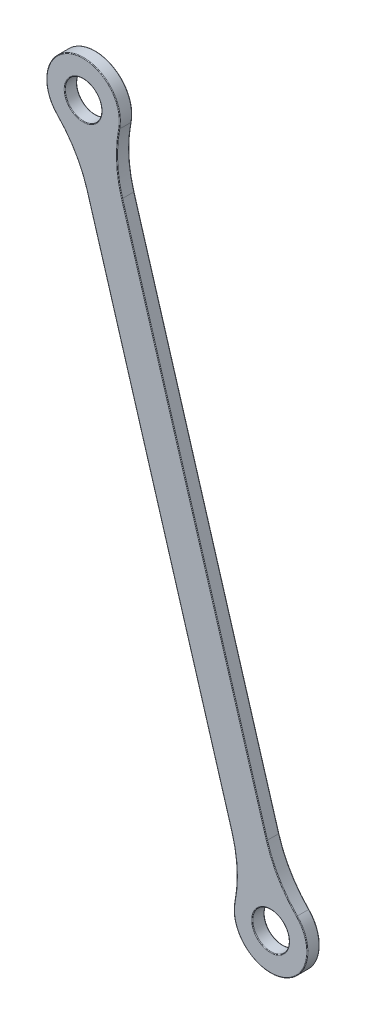
ISO-10303-21;
HEADER;
FILE_DESCRIPTION(('STEP AP214'),'2;1');
FILE_NAME('part.step','',(''),(''),'','','');
FILE_SCHEMA(('AUTOMOTIVE_DESIGN { 1 0 10303 214 1 1 1 1 }'));
ENDSEC;
DATA;
#1=APPLICATION_CONTEXT('core data for automotive mechanical design processes');
#2=APPLICATION_PROTOCOL_DEFINITION('international standard','automotive_design',2000,#1);
#3=PRODUCT_CONTEXT('',#1,'mechanical');
#4=PRODUCT('Part','Part','',(#3));
#5=PRODUCT_RELATED_PRODUCT_CATEGORY('part','',(#4));
#6=PRODUCT_DEFINITION_FORMATION('','',#4);
#7=PRODUCT_DEFINITION_CONTEXT('part definition',#1,'design');
#8=PRODUCT_DEFINITION('design','',#6,#7);
#9=PRODUCT_DEFINITION_SHAPE('','',#8);
#10=(LENGTH_UNIT() NAMED_UNIT(*) SI_UNIT(.MILLI.,.METRE.));
#11=(NAMED_UNIT(*) PLANE_ANGLE_UNIT() SI_UNIT($,.RADIAN.));
#12=(NAMED_UNIT(*) SI_UNIT($,.STERADIAN.) SOLID_ANGLE_UNIT());
#13=UNCERTAINTY_MEASURE_WITH_UNIT(LENGTH_MEASURE(1.E-05),#10,'distance_accuracy_value','');
#14=(GEOMETRIC_REPRESENTATION_CONTEXT(3) GLOBAL_UNCERTAINTY_ASSIGNED_CONTEXT((#13)) GLOBAL_UNIT_ASSIGNED_CONTEXT((#10,
#11,#12)) REPRESENTATION_CONTEXT('',''));
#15=CARTESIAN_POINT('',(0.,0.,0.));
#16=DIRECTION('',(0.,0.,1.));
#17=DIRECTION('',(1.,0.,0.));
#18=AXIS2_PLACEMENT_3D('',#15,#16,#17);
#19=CARTESIAN_POINT('',(-12.1462417472821,210.547331096124,-3.));
#20=DIRECTION('',(0.,0.,1.));
#21=DIRECTION('',(1.,0.,0.));
#22=AXIS2_PLACEMENT_3D('',#19,#20,#21);
#23=CYLINDRICAL_SURFACE('',#22,9.00000000000002);
#24=DIRECTION('',(0.,0.,1.));
#25=VECTOR('',#24,1.);
#26=CARTESIAN_POINT('',(-3.31507123833125,208.812272756518,-3.));
#27=LINE('',#26,#25);
#28=CARTESIAN_POINT('',(-3.31507123833125,208.812272756518,-0.15));
#29=VERTEX_POINT('',#28);
#30=CARTESIAN_POINT('',(-3.31507123833125,208.812272756518,-2.85));
#31=VERTEX_POINT('',#30);
#32=EDGE_CURVE('E312',#29,#31,#27,.F.);
#33=ORIENTED_EDGE('',*,*,#32,.T.);
#34=CARTESIAN_POINT('',(-12.1462417472821,210.547331096124,-2.85));
#35=DIRECTION('',(0.,0.,1.));
#36=DIRECTION('',(1.,0.,0.));
#37=AXIS2_PLACEMENT_3D('',#34,#35,#36);
#38=CIRCLE('',#37,9.00000000000002);
#39=CARTESIAN_POINT('',(-18.5681123038944,204.241811406668,-2.85));
#40=VERTEX_POINT('',#39);
#41=EDGE_CURVE('E227',#31,#40,#38,.T.);
#42=ORIENTED_EDGE('',*,*,#41,.T.);
#43=DIRECTION('',(0.,0.,1.));
#44=VECTOR('',#43,1.);
#45=CARTESIAN_POINT('',(-18.5681123038944,204.241811406668,-3.));
#46=LINE('',#45,#44);
#47=CARTESIAN_POINT('',(-18.5681123038944,204.241811406668,-0.15));
#48=VERTEX_POINT('',#47);
#49=EDGE_CURVE('E306',#40,#48,#46,.T.);
#50=ORIENTED_EDGE('',*,*,#49,.T.);
#51=CARTESIAN_POINT('',(-12.1462417472821,210.547331096124,-0.15));
#52=DIRECTION('',(0.,0.,1.));
#53=DIRECTION('',(1.,0.,0.));
#54=AXIS2_PLACEMENT_3D('',#51,#52,#53);
#55=CIRCLE('',#54,9.00000000000002);
#56=EDGE_CURVE('E225',#48,#29,#55,.F.);
#57=ORIENTED_EDGE('',*,*,#56,.T.);
#58=EDGE_LOOP('',(#33,#42,#50,#57));
#59=FACE_BOUND('',#58,.T.);
#60=ADVANCED_FACE('F41',(#59),#23,.T.);
#61=CARTESIAN_POINT('',(51.0562674674055,15.2986342936029,-3.));
#62=DIRECTION('',(-0.957920453392855,-0.287033804579924,0.));
#63=DIRECTION('',(0.287033804579924,-0.957920453392856,0.));
#64=AXIS2_PLACEMENT_3D('',#61,#62,#63);
#65=PLANE('',#64);
#66=DIRECTION('',(0.,0.,1.));
#67=VECTOR('',#66,1.);
#68=CARTESIAN_POINT('',(32.8696591290402,75.9929630701782,-3.));
#69=LINE('',#68,#67);
#70=CARTESIAN_POINT('',(32.8696591290402,75.9929630701782,-0.15));
#71=VERTEX_POINT('',#70);
#72=CARTESIAN_POINT('',(32.8696591290402,75.9929630701782,-2.85));
#73=VERTEX_POINT('',#72);
#74=EDGE_CURVE('E311',#71,#73,#69,.F.);
#75=ORIENTED_EDGE('',*,*,#74,.T.);
#76=DIRECTION('',(0.287033804579924,-0.957920453392856,0.));
#77=VECTOR('',#76,1.);
#78=CARTESIAN_POINT('',(51.0562674674055,15.2986342936029,-2.85));
#79=LINE('',#78,#77);
#80=CARTESIAN_POINT('',(-2.61544981028087,194.417730820432,-2.85));
#81=VERTEX_POINT('',#80);
#82=EDGE_CURVE('E219',#73,#81,#79,.F.);
#83=ORIENTED_EDGE('',*,*,#82,.T.);
#84=DIRECTION('',(0.,0.,1.));
#85=VECTOR('',#84,1.);
#86=CARTESIAN_POINT('',(-2.61544981028087,194.417730820432,-3.));
#87=LINE('',#86,#85);
#88=CARTESIAN_POINT('',(-2.61544981028087,194.417730820432,-0.15));
#89=VERTEX_POINT('',#88);
#90=EDGE_CURVE('E315',#81,#89,#87,.T.);
#91=ORIENTED_EDGE('',*,*,#90,.T.);
#92=DIRECTION('',(0.287033804579924,-0.957920453392856,0.));
#93=VECTOR('',#92,1.);
#94=CARTESIAN_POINT('',(32.8696591290402,75.9929630701783,-0.15));
#95=LINE('',#94,#93);
#96=EDGE_CURVE('E217',#89,#71,#95,.T.);
#97=ORIENTED_EDGE('',*,*,#96,.T.);
#98=EDGE_LOOP('',(#75,#83,#91,#97));
#99=FACE_BOUND('',#98,.T.);
#100=ADVANCED_FACE('F374',(#99),#65,.F.);
#101=CARTESIAN_POINT('',(33.7791669855057,57.2800585532673,-3.));
#102=DIRECTION('',(0.,0.,1.));
#103=DIRECTION('',(1.,0.,0.));
#104=AXIS2_PLACEMENT_3D('',#101,#102,#103);
#105=CYLINDRICAL_SURFACE('',#104,9.);
#106=DIRECTION('',(0.,0.,1.));
#107=VECTOR('',#106,1.);
#108=CARTESIAN_POINT('',(24.9479964765549,59.0151168928736,-3.));
#109=LINE('',#108,#107);
#110=CARTESIAN_POINT('',(24.9479964765549,59.0151168928736,-0.15));
#111=VERTEX_POINT('',#110);
#112=CARTESIAN_POINT('',(24.9479964765549,59.0151168928736,-2.85));
#113=VERTEX_POINT('',#112);
#114=EDGE_CURVE('E317',#111,#113,#109,.F.);
#115=ORIENTED_EDGE('',*,*,#114,.T.);
#116=CARTESIAN_POINT('',(33.7791669855057,57.2800585532673,-2.85));
#117=DIRECTION('',(0.,0.,1.));
#118=DIRECTION('',(1.,0.,0.));
#119=AXIS2_PLACEMENT_3D('',#116,#117,#118);
#120=CIRCLE('',#119,9.);
#121=CARTESIAN_POINT('',(40.2010375421181,63.5855782427231,-2.85));
#122=VERTEX_POINT('',#121);
#123=EDGE_CURVE('E210',#113,#122,#120,.T.);
#124=ORIENTED_EDGE('',*,*,#123,.T.);
#125=DIRECTION('',(0.,0.,1.));
#126=VECTOR('',#125,1.);
#127=CARTESIAN_POINT('',(40.2010375421181,63.5855782427231,-3.));
#128=LINE('',#127,#126);
#129=CARTESIAN_POINT('',(40.2010375421181,63.5855782427231,-0.15));
#130=VERTEX_POINT('',#129);
#131=EDGE_CURVE('E347',#122,#130,#128,.T.);
#132=ORIENTED_EDGE('',*,*,#131,.T.);
#133=CARTESIAN_POINT('',(33.7791669855057,57.2800585532673,-0.15));
#134=DIRECTION('',(0.,0.,1.));
#135=DIRECTION('',(1.,0.,0.));
#136=AXIS2_PLACEMENT_3D('',#133,#134,#135);
#137=CIRCLE('',#136,9.);
#138=EDGE_CURVE('E208',#130,#111,#137,.F.);
#139=ORIENTED_EDGE('',*,*,#138,.T.);
#140=EDGE_LOOP('',(#115,#124,#132,#139));
#141=FACE_BOUND('',#140,.T.);
#142=ADVANCED_FACE('F355',(#141),#105,.T.);
#143=CARTESIAN_POINT('',(42.4349833868698,12.7153300523836,-3.));
#144=DIRECTION('',(-0.957920453392855,-0.287033804579924,0.));
#145=DIRECTION('',(0.287033804579924,-0.957920453392856,0.));
#146=AXIS2_PLACEMENT_3D('',#143,#144,#145);
#147=PLANE('',#146);
#148=DIRECTION('',(0.,0.,-1.));
#149=VECTOR('',#148,1.);
#150=CARTESIAN_POINT('',(-11.2367338908166,191.834426579213,-3.));
#151=LINE('',#150,#149);
#152=CARTESIAN_POINT('',(-11.2367338908166,191.834426579213,-0.15));
#153=VERTEX_POINT('',#152);
#154=CARTESIAN_POINT('',(-11.2367338908166,191.834426579213,-2.85));
#155=VERTEX_POINT('',#154);
#156=EDGE_CURVE('E268',#153,#155,#151,.T.);
#157=ORIENTED_EDGE('',*,*,#156,.T.);
#158=DIRECTION('',(0.287033804579924,-0.957920453392856,0.));
#159=VECTOR('',#158,1.);
#160=CARTESIAN_POINT('',(24.2483750485045,73.4096588289591,-2.85));
#161=LINE('',#160,#159);
#162=CARTESIAN_POINT('',(24.2483750485045,73.409658828959,-2.85));
#163=VERTEX_POINT('',#162);
#164=EDGE_CURVE('E202',#155,#163,#161,.T.);
#165=ORIENTED_EDGE('',*,*,#164,.T.);
#166=DIRECTION('',(0.,0.,-1.));
#167=VECTOR('',#166,1.);
#168=CARTESIAN_POINT('',(24.2483750485045,73.409658828959,0.));
#169=LINE('',#168,#167);
#170=CARTESIAN_POINT('',(24.2483750485045,73.409658828959,-0.15));
#171=VERTEX_POINT('',#170);
#172=EDGE_CURVE('E345',#163,#171,#169,.F.);
#173=ORIENTED_EDGE('',*,*,#172,.T.);
#174=DIRECTION('',(0.287033804579924,-0.957920453392856,0.));
#175=VECTOR('',#174,1.);
#176=CARTESIAN_POINT('',(42.4349833868698,12.7153300523836,-0.15));
#177=LINE('',#176,#175);
#178=EDGE_CURVE('E200',#171,#153,#177,.F.);
#179=ORIENTED_EDGE('',*,*,#178,.T.);
#180=EDGE_LOOP('',(#157,#165,#173,#179));
#181=FACE_BOUND('',#180,.T.);
#182=ADVANCED_FACE('F344',(#181),#147,.T.);
#183=CARTESIAN_POINT('',(33.7791669855057,57.2800585532673,-3.));
#184=DIRECTION('',(0.,0.,1.));
#185=DIRECTION('',(1.,0.,0.));
#186=AXIS2_PLACEMENT_3D('',#183,#184,#185);
#187=CYLINDRICAL_SURFACE('',#186,4.49999999999998);
#188=CARTESIAN_POINT('',(33.7791669855057,57.2800585532673,-2.85));
#189=DIRECTION('',(0.,0.,1.));
#190=DIRECTION('',(1.,0.,0.));
#191=AXIS2_PLACEMENT_3D('',#188,#189,#190);
#192=CIRCLE('',#191,4.49999999999998);
#193=CARTESIAN_POINT('',(38.2791669855057,57.2800585532673,-2.85));
#194=VERTEX_POINT('',#193);
#195=EDGE_CURVE('E232',#194,#194,#192,.F.);
#196=ORIENTED_EDGE('',*,*,#195,.T.);
#197=EDGE_LOOP('',(#196));
#198=FACE_BOUND('',#197,.T.);
#199=CARTESIAN_POINT('',(33.7791669855057,57.2800585532673,-0.15));
#200=DIRECTION('',(0.,0.,1.));
#201=DIRECTION('',(1.,0.,0.));
#202=AXIS2_PLACEMENT_3D('',#199,#200,#201);
#203=CIRCLE('',#202,4.49999999999998);
#204=CARTESIAN_POINT('',(38.2791669855057,57.2800585532673,-0.15));
#205=VERTEX_POINT('',#204);
#206=EDGE_CURVE('E229',#205,#205,#203,.T.);
#207=ORIENTED_EDGE('',*,*,#206,.T.);
#208=EDGE_LOOP('',(#207));
#209=FACE_BOUND('',#208,.T.);
#210=ADVANCED_FACE('F410',(#198,#209),#187,.F.);
#211=CARTESIAN_POINT('',(-12.1462417472821,210.547331096124,-3.));
#212=DIRECTION('',(0.,0.,1.));
#213=DIRECTION('',(1.,0.,0.));
#214=AXIS2_PLACEMENT_3D('',#211,#212,#213);
#215=CYLINDRICAL_SURFACE('',#214,4.49999999999999);
#216=CARTESIAN_POINT('',(-12.1462417472821,210.547331096124,-2.85));
#217=DIRECTION('',(0.,0.,1.));
#218=DIRECTION('',(1.,0.,0.));
#219=AXIS2_PLACEMENT_3D('',#216,#217,#218);
#220=CIRCLE('',#219,4.49999999999999);
#221=CARTESIAN_POINT('',(-7.64624174728208,210.547331096124,-2.85));
#222=VERTEX_POINT('',#221);
#223=EDGE_CURVE('E194',#222,#222,#220,.F.);
#224=ORIENTED_EDGE('',*,*,#223,.T.);
#225=EDGE_LOOP('',(#224));
#226=FACE_BOUND('',#225,.T.);
#227=CARTESIAN_POINT('',(-12.1462417472821,210.547331096124,-0.15));
#228=DIRECTION('',(0.,0.,1.));
#229=DIRECTION('',(1.,0.,0.));
#230=AXIS2_PLACEMENT_3D('',#227,#228,#229);
#231=CIRCLE('',#230,4.49999999999999);
#232=CARTESIAN_POINT('',(-7.64624174728208,210.547331096124,-0.15));
#233=VERTEX_POINT('',#232);
#234=EDGE_CURVE('E186',#233,#233,#231,.T.);
#235=ORIENTED_EDGE('',*,*,#234,.T.);
#236=EDGE_LOOP('',(#235));
#237=FACE_BOUND('',#236,.T.);
#238=ADVANCED_FACE('F412',(#226,#237),#215,.F.);
#239=CARTESIAN_POINT('',(0.,0.,-3.));
#240=DIRECTION('',(0.,0.,1.));
#241=DIRECTION('',(1.,0.,0.));
#242=AXIS2_PLACEMENT_3D('',#239,#240,#241);
#243=PLANE('',#242);
#244=CARTESIAN_POINT('',(-12.1462417472821,210.547331096124,-3.));
#245=DIRECTION('',(0.,0.,1.));
#246=DIRECTION('',(1.,0.,0.));
#247=AXIS2_PLACEMENT_3D('',#244,#245,#246);
#248=CIRCLE('',#247,4.64999999999999);
#249=CARTESIAN_POINT('',(-7.49624174728208,210.547331096124,-3.));
#250=VERTEX_POINT('',#249);
#251=EDGE_CURVE('E183',#250,#250,#248,.T.);
#252=ORIENTED_EDGE('',*,*,#251,.T.);
#253=EDGE_LOOP('',(#252));
#254=FACE_BOUND('',#253,.T.);
#255=DIRECTION('',(0.287033804579924,-0.957920453392856,0.));
#256=VECTOR('',#255,1.);
#257=CARTESIAN_POINT('',(-11.0930458228077,191.8774816499,-3.));
#258=LINE('',#257,#256);
#259=CARTESIAN_POINT('',(24.3920631165135,73.452713899646,-3.));
#260=VERTEX_POINT('',#259);
#261=CARTESIAN_POINT('',(-11.0930458228076,191.8774816499,-3.));
#262=VERTEX_POINT('',#261);
#263=EDGE_CURVE('E181',#260,#262,#258,.F.);
#264=ORIENTED_EDGE('',*,*,#263,.T.);
#265=CARTESIAN_POINT('',(-39.9743474926022,183.223412441815,-3.));
#266=DIRECTION('',(0.,0.,1.));
#267=DIRECTION('',(1.,0.,0.));
#268=AXIS2_PLACEMENT_3D('',#265,#266,#267);
#269=CIRCLE('',#268,30.15);
#270=CARTESIAN_POINT('',(-18.4610811279509,204.346903401493,-3.));
#271=VERTEX_POINT('',#270);
#272=EDGE_CURVE('E161',#262,#271,#269,.T.);
#273=ORIENTED_EDGE('',*,*,#272,.T.);
#274=CARTESIAN_POINT('',(-12.1462417472821,210.547331096124,-3.));
#275=DIRECTION('',(0.,0.,1.));
#276=DIRECTION('',(1.,0.,0.));
#277=AXIS2_PLACEMENT_3D('',#274,#275,#276);
#278=CIRCLE('',#277,8.85000000000002);
#279=CARTESIAN_POINT('',(-3.46225741348043,208.841190395511,-3.));
#280=VERTEX_POINT('',#279);
#281=EDGE_CURVE('E169',#271,#280,#278,.F.);
#282=ORIENTED_EDGE('',*,*,#281,.T.);
#283=CARTESIAN_POINT('',(26.1221637915048,203.02874495783,-3.));
#284=DIRECTION('',(0.,0.,1.));
#285=DIRECTION('',(1.,0.,0.));
#286=AXIS2_PLACEMENT_3D('',#283,#284,#285);
#287=CIRCLE('',#286,30.15);
#288=CARTESIAN_POINT('',(-2.75913787828981,194.374675749745,-3.));
#289=VERTEX_POINT('',#288);
#290=EDGE_CURVE('E175',#280,#289,#287,.T.);
#291=ORIENTED_EDGE('',*,*,#290,.T.);
#292=DIRECTION('',(0.287033804579924,-0.957920453392856,0.));
#293=VECTOR('',#292,1.);
#294=CARTESIAN_POINT('',(50.9125793993966,15.2555792229159,-3.));
#295=LINE('',#294,#293);
#296=CARTESIAN_POINT('',(32.7259710610313,75.9499079994913,-3.));
#297=VERTEX_POINT('',#296);
#298=EDGE_CURVE('E326',#289,#297,#295,.T.);
#299=ORIENTED_EDGE('',*,*,#298,.T.);
#300=CARTESIAN_POINT('',(61.6072727308259,84.603977207576,-3.));
#301=DIRECTION('',(0.,0.,1.));
#302=DIRECTION('',(1.,0.,0.));
#303=AXIS2_PLACEMENT_3D('',#300,#301,#302);
#304=CIRCLE('',#303,30.15);
#305=CARTESIAN_POINT('',(40.0940063661745,63.4804862478988,-3.));
#306=VERTEX_POINT('',#305);
#307=EDGE_CURVE('E328',#297,#306,#304,.T.);
#308=ORIENTED_EDGE('',*,*,#307,.T.);
#309=CARTESIAN_POINT('',(33.7791669855057,57.2800585532673,-3.));
#310=DIRECTION('',(0.,0.,1.));
#311=DIRECTION('',(1.,0.,0.));
#312=AXIS2_PLACEMENT_3D('',#309,#310,#311);
#313=CIRCLE('',#312,8.85);
#314=CARTESIAN_POINT('',(25.0951826517041,58.9861992538801,-3.));
#315=VERTEX_POINT('',#314);
#316=EDGE_CURVE('E330',#306,#315,#313,.F.);
#317=ORIENTED_EDGE('',*,*,#316,.T.);
#318=CARTESIAN_POINT('',(-4.48923855328114,64.7986446915613,-3.));
#319=DIRECTION('',(0.,0.,1.));
#320=DIRECTION('',(1.,0.,0.));
#321=AXIS2_PLACEMENT_3D('',#318,#319,#320);
#322=CIRCLE('',#321,30.15);
#323=EDGE_CURVE('E188',#315,#260,#322,.T.);
#324=ORIENTED_EDGE('',*,*,#323,.T.);
#325=EDGE_LOOP('',(#264,#273,#282,#291,#299,#308,#317,#324));
#326=FACE_BOUND('',#325,.T.);
#327=CARTESIAN_POINT('',(33.7791669855057,57.2800585532673,-3.));
#328=DIRECTION('',(0.,0.,1.));
#329=DIRECTION('',(1.,0.,0.));
#330=AXIS2_PLACEMENT_3D('',#327,#328,#329);
#331=CIRCLE('',#330,4.64999999999998);
#332=CARTESIAN_POINT('',(38.4291669855057,57.2800585532673,-3.));
#333=VERTEX_POINT('',#332);
#334=EDGE_CURVE('E176',#333,#333,#331,.T.);
#335=ORIENTED_EDGE('',*,*,#334,.T.);
#336=EDGE_LOOP('',(#335));
#337=FACE_BOUND('',#336,.T.);
#338=ADVANCED_FACE('F178',(#254,#326,#337),#243,.F.);
#339=CARTESIAN_POINT('',(0.,0.,0.));
#340=DIRECTION('',(0.,0.,1.));
#341=DIRECTION('',(1.,0.,0.));
#342=AXIS2_PLACEMENT_3D('',#339,#340,#341);
#343=PLANE('',#342);
#344=CARTESIAN_POINT('',(-12.1462417472821,210.547331096124,0.));
#345=DIRECTION('',(0.,0.,1.));
#346=DIRECTION('',(1.,0.,0.));
#347=AXIS2_PLACEMENT_3D('',#344,#345,#346);
#348=CIRCLE('',#347,4.64999999999999);
#349=CARTESIAN_POINT('',(-7.49624174728208,210.547331096124,0.));
#350=VERTEX_POINT('',#349);
#351=EDGE_CURVE('E11',#350,#350,#348,.F.);
#352=ORIENTED_EDGE('',*,*,#351,.T.);
#353=EDGE_LOOP('',(#352));
#354=FACE_BOUND('',#353,.T.);
#355=CARTESIAN_POINT('',(33.7791669855057,57.2800585532673,0.));
#356=DIRECTION('',(0.,0.,1.));
#357=DIRECTION('',(1.,0.,0.));
#358=AXIS2_PLACEMENT_3D('',#355,#356,#357);
#359=CIRCLE('',#358,8.85);
#360=CARTESIAN_POINT('',(25.0951826517041,58.9861992538801,0.));
#361=VERTEX_POINT('',#360);
#362=CARTESIAN_POINT('',(40.0940063661745,63.4804862478988,0.));
#363=VERTEX_POINT('',#362);
#364=EDGE_CURVE('E58',#361,#363,#359,.T.);
#365=ORIENTED_EDGE('',*,*,#364,.T.);
#366=CARTESIAN_POINT('',(61.6072727308259,84.603977207576,0.));
#367=DIRECTION('',(0.,0.,1.));
#368=DIRECTION('',(1.,0.,0.));
#369=AXIS2_PLACEMENT_3D('',#366,#367,#368);
#370=CIRCLE('',#369,30.15);
#371=CARTESIAN_POINT('',(32.7259710610313,75.9499079994913,0.));
#372=VERTEX_POINT('',#371);
#373=EDGE_CURVE('E50',#363,#372,#370,.F.);
#374=ORIENTED_EDGE('',*,*,#373,.T.);
#375=DIRECTION('',(0.287033804579924,-0.957920453392856,0.));
#376=VECTOR('',#375,1.);
#377=CARTESIAN_POINT('',(-2.75913787828981,194.374675749745,0.));
#378=LINE('',#377,#376);
#379=CARTESIAN_POINT('',(-2.7591378782898,194.374675749745,0.));
#380=VERTEX_POINT('',#379);
#381=EDGE_CURVE('E238',#372,#380,#378,.F.);
#382=ORIENTED_EDGE('',*,*,#381,.T.);
#383=CARTESIAN_POINT('',(26.1221637915048,203.02874495783,0.));
#384=DIRECTION('',(0.,0.,1.));
#385=DIRECTION('',(1.,0.,0.));
#386=AXIS2_PLACEMENT_3D('',#383,#384,#385);
#387=CIRCLE('',#386,30.15);
#388=CARTESIAN_POINT('',(-3.46225741348043,208.841190395511,0.));
#389=VERTEX_POINT('',#388);
#390=EDGE_CURVE('E240',#380,#389,#387,.F.);
#391=ORIENTED_EDGE('',*,*,#390,.T.);
#392=CARTESIAN_POINT('',(-12.1462417472821,210.547331096124,0.));
#393=DIRECTION('',(0.,0.,1.));
#394=DIRECTION('',(1.,0.,0.));
#395=AXIS2_PLACEMENT_3D('',#392,#393,#394);
#396=CIRCLE('',#395,8.85000000000002);
#397=CARTESIAN_POINT('',(-18.4610811279509,204.346903401493,0.));
#398=VERTEX_POINT('',#397);
#399=EDGE_CURVE('E242',#389,#398,#396,.T.);
#400=ORIENTED_EDGE('',*,*,#399,.T.);
#401=CARTESIAN_POINT('',(-39.9743474926022,183.223412441815,0.));
#402=DIRECTION('',(0.,0.,1.));
#403=DIRECTION('',(1.,0.,0.));
#404=AXIS2_PLACEMENT_3D('',#401,#402,#403);
#405=CIRCLE('',#404,30.15);
#406=CARTESIAN_POINT('',(-11.0930458228076,191.8774816499,0.));
#407=VERTEX_POINT('',#406);
#408=EDGE_CURVE('E244',#398,#407,#405,.F.);
#409=ORIENTED_EDGE('',*,*,#408,.T.);
#410=DIRECTION('',(0.287033804579924,-0.957920453392856,0.));
#411=VECTOR('',#410,1.);
#412=CARTESIAN_POINT('',(42.5786714548788,12.7583851230706,0.));
#413=LINE('',#412,#411);
#414=CARTESIAN_POINT('',(24.3920631165135,73.452713899646,0.));
#415=VERTEX_POINT('',#414);
#416=EDGE_CURVE('E246',#407,#415,#413,.T.);
#417=ORIENTED_EDGE('',*,*,#416,.T.);
#418=CARTESIAN_POINT('',(-4.48923855328114,64.7986446915613,0.));
#419=DIRECTION('',(0.,0.,1.));
#420=DIRECTION('',(1.,0.,0.));
#421=AXIS2_PLACEMENT_3D('',#418,#419,#420);
#422=CIRCLE('',#421,30.15);
#423=EDGE_CURVE('E63',#415,#361,#422,.F.);
#424=ORIENTED_EDGE('',*,*,#423,.T.);
#425=EDGE_LOOP('',(#365,#374,#382,#391,#400,#409,#417,#424));
#426=FACE_BOUND('',#425,.T.);
#427=CARTESIAN_POINT('',(33.7791669855057,57.2800585532673,0.));
#428=DIRECTION('',(0.,0.,1.));
#429=DIRECTION('',(1.,0.,0.));
#430=AXIS2_PLACEMENT_3D('',#427,#428,#429);
#431=CIRCLE('',#430,4.64999999999998);
#432=CARTESIAN_POINT('',(38.4291669855057,57.2800585532673,0.));
#433=VERTEX_POINT('',#432);
#434=EDGE_CURVE('E235',#433,#433,#431,.F.);
#435=ORIENTED_EDGE('',*,*,#434,.T.);
#436=EDGE_LOOP('',(#435));
#437=FACE_BOUND('',#436,.T.);
#438=ADVANCED_FACE('F391',(#354,#426,#437),#343,.T.);
#439=CARTESIAN_POINT('',(-4.48923855328114,64.7986446915613,-3.));
#440=DIRECTION('',(0.,0.,1.));
#441=DIRECTION('',(1.,0.,0.));
#442=AXIS2_PLACEMENT_3D('',#439,#440,#441);
#443=CYLINDRICAL_SURFACE('',#442,30.);
#444=ORIENTED_EDGE('',*,*,#172,.F.);
#445=CARTESIAN_POINT('',(-4.48923855328114,64.7986446915613,-2.85));
#446=DIRECTION('',(0.,0.,1.));
#447=DIRECTION('',(1.,0.,0.));
#448=AXIS2_PLACEMENT_3D('',#445,#446,#447);
#449=CIRCLE('',#448,30.);
#450=EDGE_CURVE('E206',#163,#113,#449,.F.);
#451=ORIENTED_EDGE('',*,*,#450,.T.);
#452=ORIENTED_EDGE('',*,*,#114,.F.);
#453=CARTESIAN_POINT('',(-4.48923855328114,64.7986446915613,-0.15));
#454=DIRECTION('',(0.,0.,1.));
#455=DIRECTION('',(1.,0.,0.));
#456=AXIS2_PLACEMENT_3D('',#453,#454,#455);
#457=CIRCLE('',#456,30.);
#458=EDGE_CURVE('E204',#111,#171,#457,.T.);
#459=ORIENTED_EDGE('',*,*,#458,.T.);
#460=EDGE_LOOP('',(#444,#451,#452,#459));
#461=FACE_BOUND('',#460,.T.);
#462=ADVANCED_FACE('F389',(#461),#443,.F.);
#463=CARTESIAN_POINT('',(-39.9743474926022,183.223412441815,-3.));
#464=DIRECTION('',(0.,0.,1.));
#465=DIRECTION('',(1.,0.,0.));
#466=AXIS2_PLACEMENT_3D('',#463,#464,#465);
#467=CYLINDRICAL_SURFACE('',#466,30.);
#468=ORIENTED_EDGE('',*,*,#49,.F.);
#469=CARTESIAN_POINT('',(-39.9743474926022,183.223412441815,-2.85));
#470=DIRECTION('',(0.,0.,1.));
#471=DIRECTION('',(1.,0.,0.));
#472=AXIS2_PLACEMENT_3D('',#469,#470,#471);
#473=CIRCLE('',#472,30.);
#474=EDGE_CURVE('E163',#40,#155,#473,.F.);
#475=ORIENTED_EDGE('',*,*,#474,.T.);
#476=ORIENTED_EDGE('',*,*,#156,.F.);
#477=CARTESIAN_POINT('',(-39.9743474926022,183.223412441815,-0.15));
#478=DIRECTION('',(0.,0.,1.));
#479=DIRECTION('',(1.,0.,0.));
#480=AXIS2_PLACEMENT_3D('',#477,#478,#479);
#481=CIRCLE('',#480,30.);
#482=EDGE_CURVE('E197',#153,#48,#481,.T.);
#483=ORIENTED_EDGE('',*,*,#482,.T.);
#484=EDGE_LOOP('',(#468,#475,#476,#483));
#485=FACE_BOUND('',#484,.T.);
#486=ADVANCED_FACE('F305',(#485),#467,.F.);
#487=CARTESIAN_POINT('',(26.1221637915048,203.02874495783,-3.));
#488=DIRECTION('',(0.,0.,1.));
#489=DIRECTION('',(1.,0.,0.));
#490=AXIS2_PLACEMENT_3D('',#487,#488,#489);
#491=CYLINDRICAL_SURFACE('',#490,30.);
#492=ORIENTED_EDGE('',*,*,#90,.F.);
#493=CARTESIAN_POINT('',(26.1221637915048,203.02874495783,-2.85));
#494=DIRECTION('',(0.,0.,1.));
#495=DIRECTION('',(1.,0.,0.));
#496=AXIS2_PLACEMENT_3D('',#493,#494,#495);
#497=CIRCLE('',#496,30.);
#498=EDGE_CURVE('E223',#81,#31,#497,.F.);
#499=ORIENTED_EDGE('',*,*,#498,.T.);
#500=ORIENTED_EDGE('',*,*,#32,.F.);
#501=CARTESIAN_POINT('',(26.1221637915048,203.02874495783,-0.15));
#502=DIRECTION('',(0.,0.,1.));
#503=DIRECTION('',(1.,0.,0.));
#504=AXIS2_PLACEMENT_3D('',#501,#502,#503);
#505=CIRCLE('',#504,30.);
#506=EDGE_CURVE('E221',#29,#89,#505,.T.);
#507=ORIENTED_EDGE('',*,*,#506,.T.);
#508=EDGE_LOOP('',(#492,#499,#500,#507));
#509=FACE_BOUND('',#508,.T.);
#510=ADVANCED_FACE('F397',(#509),#491,.F.);
#511=CARTESIAN_POINT('',(61.6072727308259,84.603977207576,-3.));
#512=DIRECTION('',(0.,0.,1.));
#513=DIRECTION('',(1.,0.,0.));
#514=AXIS2_PLACEMENT_3D('',#511,#512,#513);
#515=CYLINDRICAL_SURFACE('',#514,30.);
#516=ORIENTED_EDGE('',*,*,#131,.F.);
#517=CARTESIAN_POINT('',(61.6072727308259,84.603977207576,-2.85));
#518=DIRECTION('',(0.,0.,1.));
#519=DIRECTION('',(1.,0.,0.));
#520=AXIS2_PLACEMENT_3D('',#517,#518,#519);
#521=CIRCLE('',#520,30.);
#522=EDGE_CURVE('E215',#122,#73,#521,.F.);
#523=ORIENTED_EDGE('',*,*,#522,.T.);
#524=ORIENTED_EDGE('',*,*,#74,.F.);
#525=CARTESIAN_POINT('',(61.6072727308259,84.603977207576,-0.15));
#526=DIRECTION('',(0.,0.,1.));
#527=DIRECTION('',(1.,0.,0.));
#528=AXIS2_PLACEMENT_3D('',#525,#526,#527);
#529=CIRCLE('',#528,30.);
#530=EDGE_CURVE('E212',#71,#130,#529,.T.);
#531=ORIENTED_EDGE('',*,*,#530,.T.);
#532=EDGE_LOOP('',(#516,#523,#524,#531));
#533=FACE_BOUND('',#532,.T.);
#534=ADVANCED_FACE('F371',(#533),#515,.F.);
#535=CARTESIAN_POINT('',(-12.1462417472821,210.547331096124,-2.85));
#536=DIRECTION('',(0.,0.,1.));
#537=DIRECTION('',(1.,0.,0.));
#538=AXIS2_PLACEMENT_3D('',#535,#536,#537);
#539=TOROIDAL_SURFACE('',#538,4.64999999999999,0.15);
#540=ORIENTED_EDGE('',*,*,#223,.F.);
#541=EDGE_LOOP('',(#540));
#542=FACE_BOUND('',#541,.T.);
#543=ORIENTED_EDGE('',*,*,#251,.F.);
#544=EDGE_LOOP('',(#543));
#545=FACE_BOUND('',#544,.T.);
#546=ADVANCED_FACE('F475',(#542,#545),#539,.T.);
#547=CARTESIAN_POINT('',(61.6072727308259,84.603977207576,-2.85));
#548=DIRECTION('',(0.,0.,1.));
#549=DIRECTION('',(1.,0.,0.));
#550=AXIS2_PLACEMENT_3D('',#547,#548,#549);
#551=TOROIDAL_SURFACE('',#550,30.15,0.15);
#552=CARTESIAN_POINT('',(32.7259710610313,75.9499079994913,-2.85));
#553=DIRECTION('',(-0.287033804579898,0.957920453392863,0.));
#554=DIRECTION('',(-0.957920453392863,-0.287033804579898,0.));
#555=AXIS2_PLACEMENT_3D('',#552,#553,#554);
#556=CIRCLE('',#555,0.15);
#557=EDGE_CURVE('E262',#73,#297,#556,.T.);
#558=ORIENTED_EDGE('',*,*,#557,.F.);
#559=ORIENTED_EDGE('',*,*,#522,.F.);
#560=CARTESIAN_POINT('',(40.0940063661745,63.4804862478988,-2.85));
#561=DIRECTION('',(0.700613298828439,-0.713541172956917,0.));
#562=DIRECTION('',(0.713541172956917,0.700613298828439,0.));
#563=AXIS2_PLACEMENT_3D('',#560,#561,#562);
#564=CIRCLE('',#563,0.15);
#565=EDGE_CURVE('E265',#306,#122,#564,.T.);
#566=ORIENTED_EDGE('',*,*,#565,.F.);
#567=ORIENTED_EDGE('',*,*,#307,.F.);
#568=EDGE_LOOP('',(#558,#559,#566,#567));
#569=FACE_BOUND('',#568,.T.);
#570=ADVANCED_FACE('F367',(#569),#551,.T.);
#571=CARTESIAN_POINT('',(33.7791669855057,57.2800585532673,-2.85));
#572=DIRECTION('',(0.,0.,1.));
#573=DIRECTION('',(1.,0.,0.));
#574=AXIS2_PLACEMENT_3D('',#571,#572,#573);
#575=TOROIDAL_SURFACE('',#574,8.85,0.15);
#576=ORIENTED_EDGE('',*,*,#565,.T.);
#577=ORIENTED_EDGE('',*,*,#123,.F.);
#578=CARTESIAN_POINT('',(25.0951826517041,58.9861992538801,-2.85));
#579=DIRECTION('',(0.192784259956252,0.981241167661203,0.));
#580=DIRECTION('',(-0.981241167661203,0.192784259956252,0.));
#581=AXIS2_PLACEMENT_3D('',#578,#579,#580);
#582=CIRCLE('',#581,0.15);
#583=EDGE_CURVE('E259',#315,#113,#582,.T.);
#584=ORIENTED_EDGE('',*,*,#583,.F.);
#585=ORIENTED_EDGE('',*,*,#316,.F.);
#586=EDGE_LOOP('',(#576,#577,#584,#585));
#587=FACE_BOUND('',#586,.T.);
#588=ADVANCED_FACE('F361',(#587),#575,.T.);
#589=CARTESIAN_POINT('',(50.9125793993966,15.2555792229159,-2.85));
#590=DIRECTION('',(0.287033804579924,-0.957920453392856,0.));
#591=DIRECTION('',(0.957920453392856,0.287033804579924,0.));
#592=AXIS2_PLACEMENT_3D('',#589,#590,#591);
#593=CYLINDRICAL_SURFACE('',#592,0.15);
#594=ORIENTED_EDGE('',*,*,#557,.T.);
#595=ORIENTED_EDGE('',*,*,#298,.F.);
#596=CARTESIAN_POINT('',(-2.7591378782898,194.374675749745,-2.85));
#597=DIRECTION('',(-0.287033804579982,0.957920453392838,0.));
#598=DIRECTION('',(-0.957920453392838,-0.287033804579982,0.));
#599=AXIS2_PLACEMENT_3D('',#596,#597,#598);
#600=CIRCLE('',#599,0.15);
#601=EDGE_CURVE('E256',#81,#289,#600,.T.);
#602=ORIENTED_EDGE('',*,*,#601,.F.);
#603=ORIENTED_EDGE('',*,*,#82,.F.);
#604=EDGE_LOOP('',(#594,#595,#602,#603));
#605=FACE_BOUND('',#604,.T.);
#606=ADVANCED_FACE('F478',(#605),#593,.T.);
#607=CARTESIAN_POINT('',(-4.48923855328114,64.7986446915613,-2.85));
#608=DIRECTION('',(0.,0.,1.));
#609=DIRECTION('',(1.,0.,0.));
#610=AXIS2_PLACEMENT_3D('',#607,#608,#609);
#611=TOROIDAL_SURFACE('',#610,30.15,0.15);
#612=ORIENTED_EDGE('',*,*,#583,.T.);
#613=ORIENTED_EDGE('',*,*,#450,.F.);
#614=CARTESIAN_POINT('',(24.3920631165135,73.452713899646,-2.85));
#615=DIRECTION('',(-0.287033804579892,0.957920453392865,0.));
#616=DIRECTION('',(-0.957920453392865,-0.287033804579892,0.));
#617=AXIS2_PLACEMENT_3D('',#614,#615,#616);
#618=CIRCLE('',#617,0.15);
#619=EDGE_CURVE('E253',#260,#163,#618,.T.);
#620=ORIENTED_EDGE('',*,*,#619,.F.);
#621=ORIENTED_EDGE('',*,*,#323,.F.);
#622=EDGE_LOOP('',(#612,#613,#620,#621));
#623=FACE_BOUND('',#622,.T.);
#624=ADVANCED_FACE('F337',(#623),#611,.T.);
#625=CARTESIAN_POINT('',(26.1221637915048,203.02874495783,-2.85));
#626=DIRECTION('',(0.,0.,1.));
#627=DIRECTION('',(1.,0.,0.));
#628=AXIS2_PLACEMENT_3D('',#625,#626,#627);
#629=TOROIDAL_SURFACE('',#628,30.15,0.15);
#630=ORIENTED_EDGE('',*,*,#601,.T.);
#631=ORIENTED_EDGE('',*,*,#290,.F.);
#632=CARTESIAN_POINT('',(-3.46225741348043,208.841190395511,-2.85));
#633=DIRECTION('',(0.192784259956208,0.981241167661211,0.));
#634=DIRECTION('',(-0.981241167661211,0.192784259956208,0.));
#635=AXIS2_PLACEMENT_3D('',#632,#633,#634);
#636=CIRCLE('',#635,0.15);
#637=EDGE_CURVE('E172',#31,#280,#636,.T.);
#638=ORIENTED_EDGE('',*,*,#637,.F.);
#639=ORIENTED_EDGE('',*,*,#498,.F.);
#640=EDGE_LOOP('',(#630,#631,#638,#639));
#641=FACE_BOUND('',#640,.T.);
#642=ADVANCED_FACE('F484',(#641),#629,.T.);
#643=CARTESIAN_POINT('',(42.5786714548788,12.7583851230706,-2.85));
#644=DIRECTION('',(-0.287033804579924,0.957920453392856,0.));
#645=DIRECTION('',(-0.957920453392856,-0.287033804579924,0.));
#646=AXIS2_PLACEMENT_3D('',#643,#644,#645);
#647=CYLINDRICAL_SURFACE('',#646,0.15);
#648=ORIENTED_EDGE('',*,*,#619,.T.);
#649=ORIENTED_EDGE('',*,*,#164,.F.);
#650=CARTESIAN_POINT('',(-11.0930458228076,191.8774816499,-2.85));
#651=DIRECTION('',(-0.287033804579977,0.95792045339284,0.));
#652=DIRECTION('',(-0.95792045339284,-0.287033804579977,0.));
#653=AXIS2_PLACEMENT_3D('',#650,#651,#652);
#654=CIRCLE('',#653,0.15);
#655=EDGE_CURVE('E166',#262,#155,#654,.T.);
#656=ORIENTED_EDGE('',*,*,#655,.F.);
#657=ORIENTED_EDGE('',*,*,#263,.F.);
#658=EDGE_LOOP('',(#648,#649,#656,#657));
#659=FACE_BOUND('',#658,.T.);
#660=ADVANCED_FACE('F340',(#659),#647,.T.);
#661=CARTESIAN_POINT('',(-12.1462417472821,210.547331096124,-2.85));
#662=DIRECTION('',(0.,0.,1.));
#663=DIRECTION('',(1.,0.,0.));
#664=AXIS2_PLACEMENT_3D('',#661,#662,#663);
#665=TOROIDAL_SURFACE('',#664,8.85000000000002,0.15);
#666=ORIENTED_EDGE('',*,*,#637,.T.);
#667=ORIENTED_EDGE('',*,*,#281,.F.);
#668=CARTESIAN_POINT('',(-18.4610811279509,204.346903401493,-2.85));
#669=DIRECTION('',(0.700613298828392,-0.713541172956963,0.));
#670=DIRECTION('',(0.713541172956963,0.700613298828392,0.));
#671=AXIS2_PLACEMENT_3D('',#668,#669,#670);
#672=CIRCLE('',#671,0.15);
#673=EDGE_CURVE('E157',#40,#271,#672,.T.);
#674=ORIENTED_EDGE('',*,*,#673,.F.);
#675=ORIENTED_EDGE('',*,*,#41,.F.);
#676=EDGE_LOOP('',(#666,#667,#674,#675));
#677=FACE_BOUND('',#676,.T.);
#678=ADVANCED_FACE('F170',(#677),#665,.T.);
#679=CARTESIAN_POINT('',(-39.9743474926022,183.223412441815,-2.85));
#680=DIRECTION('',(0.,0.,1.));
#681=DIRECTION('',(1.,0.,0.));
#682=AXIS2_PLACEMENT_3D('',#679,#680,#681);
#683=TOROIDAL_SURFACE('',#682,30.15,0.15);
#684=ORIENTED_EDGE('',*,*,#655,.T.);
#685=ORIENTED_EDGE('',*,*,#474,.F.);
#686=ORIENTED_EDGE('',*,*,#673,.T.);
#687=ORIENTED_EDGE('',*,*,#272,.F.);
#688=EDGE_LOOP('',(#684,#685,#686,#687));
#689=FACE_BOUND('',#688,.T.);
#690=ADVANCED_FACE('F159',(#689),#683,.T.);
#691=CARTESIAN_POINT('',(33.7791669855057,57.2800585532673,-2.85));
#692=DIRECTION('',(0.,0.,1.));
#693=DIRECTION('',(1.,0.,0.));
#694=AXIS2_PLACEMENT_3D('',#691,#692,#693);
#695=TOROIDAL_SURFACE('',#694,4.64999999999998,0.15);
#696=ORIENTED_EDGE('',*,*,#334,.F.);
#697=EDGE_LOOP('',(#696));
#698=FACE_BOUND('',#697,.T.);
#699=ORIENTED_EDGE('',*,*,#195,.F.);
#700=EDGE_LOOP('',(#699));
#701=FACE_BOUND('',#700,.T.);
#702=ADVANCED_FACE('F456',(#698,#701),#695,.T.);
#703=CARTESIAN_POINT('',(-12.1462417472821,210.547331096124,-0.15));
#704=DIRECTION('',(0.,0.,1.));
#705=DIRECTION('',(1.,0.,0.));
#706=AXIS2_PLACEMENT_3D('',#703,#704,#705);
#707=TOROIDAL_SURFACE('',#706,4.64999999999999,0.15);
#708=ORIENTED_EDGE('',*,*,#351,.F.);
#709=EDGE_LOOP('',(#708));
#710=FACE_BOUND('',#709,.T.);
#711=ORIENTED_EDGE('',*,*,#234,.F.);
#712=EDGE_LOOP('',(#711));
#713=FACE_BOUND('',#712,.T.);
#714=ADVANCED_FACE('F437',(#710,#713),#707,.T.);
#715=CARTESIAN_POINT('',(-39.9743474926022,183.223412441815,-0.15));
#716=DIRECTION('',(0.,0.,1.));
#717=DIRECTION('',(1.,0.,0.));
#718=AXIS2_PLACEMENT_3D('',#715,#716,#717);
#719=TOROIDAL_SURFACE('',#718,30.15,0.15);
#720=CARTESIAN_POINT('',(-18.4610811279509,204.346903401493,-0.15));
#721=DIRECTION('',(-0.700613298828392,0.713541172956963,0.));
#722=DIRECTION('',(-0.713541172956963,-0.700613298828392,0.));
#723=AXIS2_PLACEMENT_3D('',#720,#721,#722);
#724=CIRCLE('',#723,0.15);
#725=EDGE_CURVE('E284',#48,#398,#724,.T.);
#726=ORIENTED_EDGE('',*,*,#725,.F.);
#727=ORIENTED_EDGE('',*,*,#482,.F.);
#728=CARTESIAN_POINT('',(-11.0930458228076,191.8774816499,-0.15));
#729=DIRECTION('',(0.287033804579989,-0.957920453392836,0.));
#730=DIRECTION('',(0.957920453392836,0.28703380457999,0.));
#731=AXIS2_PLACEMENT_3D('',#728,#729,#730);
#732=CIRCLE('',#731,0.15);
#733=EDGE_CURVE('E45',#407,#153,#732,.T.);
#734=ORIENTED_EDGE('',*,*,#733,.F.);
#735=ORIENTED_EDGE('',*,*,#408,.F.);
#736=EDGE_LOOP('',(#726,#727,#734,#735));
#737=FACE_BOUND('',#736,.T.);
#738=ADVANCED_FACE('F300',(#737),#719,.T.);
#739=CARTESIAN_POINT('',(42.5786714548788,12.7583851230706,-0.15));
#740=DIRECTION('',(0.287033804579924,-0.957920453392856,0.));
#741=DIRECTION('',(0.957920453392856,0.287033804579924,0.));
#742=AXIS2_PLACEMENT_3D('',#739,#740,#741);
#743=CYLINDRICAL_SURFACE('',#742,0.15);
#744=ORIENTED_EDGE('',*,*,#733,.T.);
#745=ORIENTED_EDGE('',*,*,#178,.F.);
#746=CARTESIAN_POINT('',(24.3920631165135,73.452713899646,-0.15));
#747=DIRECTION('',(0.287033804579892,-0.957920453392865,0.));
#748=DIRECTION('',(0.957920453392865,0.287033804579892,0.));
#749=AXIS2_PLACEMENT_3D('',#746,#747,#748);
#750=CIRCLE('',#749,0.15);
#751=EDGE_CURVE('E282',#415,#171,#750,.T.);
#752=ORIENTED_EDGE('',*,*,#751,.F.);
#753=ORIENTED_EDGE('',*,*,#416,.F.);
#754=EDGE_LOOP('',(#744,#745,#752,#753));
#755=FACE_BOUND('',#754,.T.);
#756=ADVANCED_FACE('F295',(#755),#743,.T.);
#757=CARTESIAN_POINT('',(-12.1462417472821,210.547331096124,-0.15));
#758=DIRECTION('',(0.,0.,1.));
#759=DIRECTION('',(1.,0.,0.));
#760=AXIS2_PLACEMENT_3D('',#757,#758,#759);
#761=TOROIDAL_SURFACE('',#760,8.85000000000002,0.15);
#762=ORIENTED_EDGE('',*,*,#725,.T.);
#763=ORIENTED_EDGE('',*,*,#399,.F.);
#764=CARTESIAN_POINT('',(-3.46225741348043,208.841190395511,-0.15));
#765=DIRECTION('',(-0.192784259956208,-0.981241167661211,0.));
#766=DIRECTION('',(0.981241167661211,-0.192784259956208,0.));
#767=AXIS2_PLACEMENT_3D('',#764,#765,#766);
#768=CIRCLE('',#767,0.15);
#769=EDGE_CURVE('E279',#29,#389,#768,.T.);
#770=ORIENTED_EDGE('',*,*,#769,.F.);
#771=ORIENTED_EDGE('',*,*,#56,.F.);
#772=EDGE_LOOP('',(#762,#763,#770,#771));
#773=FACE_BOUND('',#772,.T.);
#774=ADVANCED_FACE('F448',(#773),#761,.T.);
#775=CARTESIAN_POINT('',(-4.48923855328114,64.7986446915613,-0.15));
#776=DIRECTION('',(0.,0.,1.));
#777=DIRECTION('',(1.,0.,0.));
#778=AXIS2_PLACEMENT_3D('',#775,#776,#777);
#779=TOROIDAL_SURFACE('',#778,30.15,0.15);
#780=ORIENTED_EDGE('',*,*,#751,.T.);
#781=ORIENTED_EDGE('',*,*,#458,.F.);
#782=CARTESIAN_POINT('',(25.0951826517041,58.9861992538801,-0.15));
#783=DIRECTION('',(-0.192784259956244,-0.981241167661204,0.));
#784=DIRECTION('',(0.981241167661204,-0.192784259956244,0.));
#785=AXIS2_PLACEMENT_3D('',#782,#783,#784);
#786=CIRCLE('',#785,0.15);
#787=EDGE_CURVE('E276',#361,#111,#786,.T.);
#788=ORIENTED_EDGE('',*,*,#787,.F.);
#789=ORIENTED_EDGE('',*,*,#423,.F.);
#790=EDGE_LOOP('',(#780,#781,#788,#789));
#791=FACE_BOUND('',#790,.T.);
#792=ADVANCED_FACE('F388',(#791),#779,.T.);
#793=CARTESIAN_POINT('',(26.1221637915048,203.02874495783,-0.15));
#794=DIRECTION('',(0.,0.,1.));
#795=DIRECTION('',(1.,0.,0.));
#796=AXIS2_PLACEMENT_3D('',#793,#794,#795);
#797=TOROIDAL_SURFACE('',#796,30.15,0.15);
#798=ORIENTED_EDGE('',*,*,#769,.T.);
#799=ORIENTED_EDGE('',*,*,#390,.F.);
#800=CARTESIAN_POINT('',(-2.75913787828981,194.374675749745,-0.15));
#801=DIRECTION('',(0.287033804579982,-0.957920453392838,0.));
#802=DIRECTION('',(0.957920453392838,0.287033804579982,0.));
#803=AXIS2_PLACEMENT_3D('',#800,#801,#802);
#804=CIRCLE('',#803,0.15);
#805=EDGE_CURVE('E273',#89,#380,#804,.T.);
#806=ORIENTED_EDGE('',*,*,#805,.F.);
#807=ORIENTED_EDGE('',*,*,#506,.F.);
#808=EDGE_LOOP('',(#798,#799,#806,#807));
#809=FACE_BOUND('',#808,.T.);
#810=ADVANCED_FACE('F442',(#809),#797,.T.);
#811=CARTESIAN_POINT('',(33.7791669855057,57.2800585532673,-0.15));
#812=DIRECTION('',(0.,0.,1.));
#813=DIRECTION('',(1.,0.,0.));
#814=AXIS2_PLACEMENT_3D('',#811,#812,#813);
#815=TOROIDAL_SURFACE('',#814,8.85,0.15);
#816=ORIENTED_EDGE('',*,*,#787,.T.);
#817=ORIENTED_EDGE('',*,*,#138,.F.);
#818=CARTESIAN_POINT('',(40.0940063661745,63.4804862478988,-0.15));
#819=DIRECTION('',(-0.700613298828439,0.713541172956917,0.));
#820=DIRECTION('',(-0.713541172956917,-0.700613298828439,0.));
#821=AXIS2_PLACEMENT_3D('',#818,#819,#820);
#822=CIRCLE('',#821,0.15);
#823=EDGE_CURVE('E271',#363,#130,#822,.T.);
#824=ORIENTED_EDGE('',*,*,#823,.F.);
#825=ORIENTED_EDGE('',*,*,#364,.F.);
#826=EDGE_LOOP('',(#816,#817,#824,#825));
#827=FACE_BOUND('',#826,.T.);
#828=ADVANCED_FACE('F386',(#827),#815,.T.);
#829=CARTESIAN_POINT('',(50.9125793993966,15.2555792229159,-0.15));
#830=DIRECTION('',(-0.287033804579924,0.957920453392856,0.));
#831=DIRECTION('',(-0.957920453392856,-0.287033804579924,0.));
#832=AXIS2_PLACEMENT_3D('',#829,#830,#831);
#833=CYLINDRICAL_SURFACE('',#832,0.15);
#834=ORIENTED_EDGE('',*,*,#805,.T.);
#835=ORIENTED_EDGE('',*,*,#381,.F.);
#836=CARTESIAN_POINT('',(32.7259710610313,75.9499079994913,-0.15));
#837=DIRECTION('',(0.287033804579898,-0.957920453392863,0.));
#838=DIRECTION('',(0.957920453392863,0.287033804579898,0.));
#839=AXIS2_PLACEMENT_3D('',#836,#837,#838);
#840=CIRCLE('',#839,0.15);
#841=EDGE_CURVE('E269',#71,#372,#840,.T.);
#842=ORIENTED_EDGE('',*,*,#841,.F.);
#843=ORIENTED_EDGE('',*,*,#96,.F.);
#844=EDGE_LOOP('',(#834,#835,#842,#843));
#845=FACE_BOUND('',#844,.T.);
#846=ADVANCED_FACE('F380',(#845),#833,.T.);
#847=CARTESIAN_POINT('',(61.6072727308259,84.603977207576,-0.15));
#848=DIRECTION('',(0.,0.,1.));
#849=DIRECTION('',(1.,0.,0.));
#850=AXIS2_PLACEMENT_3D('',#847,#848,#849);
#851=TOROIDAL_SURFACE('',#850,30.15,0.15);
#852=ORIENTED_EDGE('',*,*,#823,.T.);
#853=ORIENTED_EDGE('',*,*,#530,.F.);
#854=ORIENTED_EDGE('',*,*,#841,.T.);
#855=ORIENTED_EDGE('',*,*,#373,.F.);
#856=EDGE_LOOP('',(#852,#853,#854,#855));
#857=FACE_BOUND('',#856,.T.);
#858=ADVANCED_FACE('F384',(#857),#851,.T.);
#859=CARTESIAN_POINT('',(33.7791669855057,57.2800585532673,-0.15));
#860=DIRECTION('',(0.,0.,1.));
#861=DIRECTION('',(1.,0.,0.));
#862=AXIS2_PLACEMENT_3D('',#859,#860,#861);
#863=TOROIDAL_SURFACE('',#862,4.64999999999998,0.15);
#864=ORIENTED_EDGE('',*,*,#206,.F.);
#865=EDGE_LOOP('',(#864));
#866=FACE_BOUND('',#865,.T.);
#867=ORIENTED_EDGE('',*,*,#434,.F.);
#868=EDGE_LOOP('',(#867));
#869=FACE_BOUND('',#868,.T.);
#870=ADVANCED_FACE('F43',(#866,#869),#863,.T.);
#871=CLOSED_SHELL('',(#60,#100,#142,#182,#210,#238,#338,#438,#462,#486,#510,#534,#546,#570,#588,
#606,#624,#642,#660,#678,#690,#702,#714,#738,#756,#774,#792,#810,#828,#846,#858,#870));
#872=MANIFOLD_SOLID_BREP('B2',#871);
#873=ADVANCED_BREP_SHAPE_REPRESENTATION('',(#18,#872),#14);
#874=SHAPE_DEFINITION_REPRESENTATION(#9,#873);
ENDSEC;
END-ISO-10303-21;
